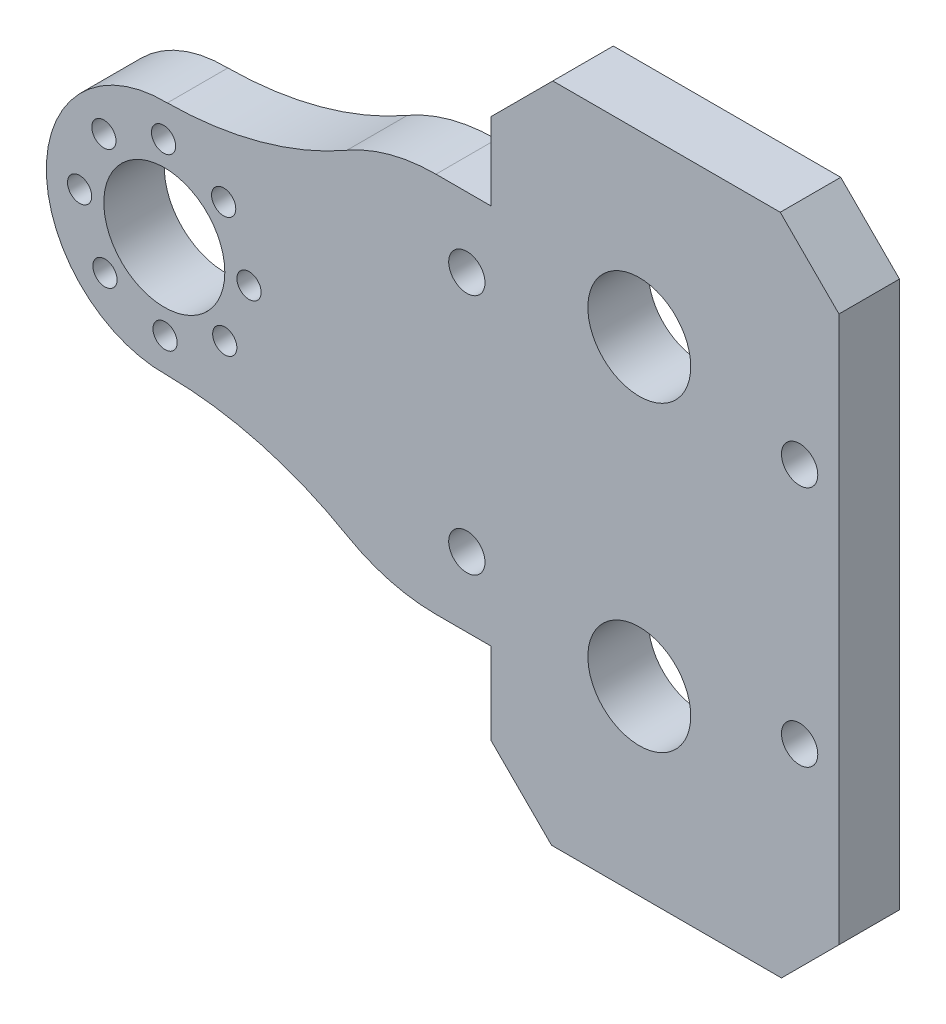
ISO-10303-21;
HEADER;
FILE_DESCRIPTION(('STEP AP214'),'2;1');
FILE_NAME('part.step','',(''),(''),'','','');
FILE_SCHEMA(('AUTOMOTIVE_DESIGN { 1 0 10303 214 1 1 1 1 }'));
ENDSEC;
DATA;
#1=APPLICATION_CONTEXT('core data for automotive mechanical design processes');
#2=APPLICATION_PROTOCOL_DEFINITION('international standard','automotive_design',2000,#1);
#3=PRODUCT_CONTEXT('',#1,'mechanical');
#4=PRODUCT('Part','Part','',(#3));
#5=PRODUCT_RELATED_PRODUCT_CATEGORY('part','',(#4));
#6=PRODUCT_DEFINITION_FORMATION('','',#4);
#7=PRODUCT_DEFINITION_CONTEXT('part definition',#1,'design');
#8=PRODUCT_DEFINITION('design','',#6,#7);
#9=PRODUCT_DEFINITION_SHAPE('','',#8);
#10=(LENGTH_UNIT() NAMED_UNIT(*) SI_UNIT(.MILLI.,.METRE.));
#11=(NAMED_UNIT(*) PLANE_ANGLE_UNIT() SI_UNIT($,.RADIAN.));
#12=(NAMED_UNIT(*) SI_UNIT($,.STERADIAN.) SOLID_ANGLE_UNIT());
#13=UNCERTAINTY_MEASURE_WITH_UNIT(LENGTH_MEASURE(1.E-05),#10,'distance_accuracy_value','');
#14=(GEOMETRIC_REPRESENTATION_CONTEXT(3) GLOBAL_UNCERTAINTY_ASSIGNED_CONTEXT((#13)) GLOBAL_UNIT_ASSIGNED_CONTEXT((#10,
#11,#12)) REPRESENTATION_CONTEXT('',''));
#15=CARTESIAN_POINT('',(0.,0.,0.));
#16=DIRECTION('',(0.,0.,1.));
#17=DIRECTION('',(1.,0.,0.));
#18=AXIS2_PLACEMENT_3D('',#15,#16,#17);
#19=CARTESIAN_POINT('',(16.700860260171,3.2922916539892,5.));
#20=DIRECTION('',(0.,0.,1.));
#21=DIRECTION('',(1.,0.,0.));
#22=AXIS2_PLACEMENT_3D('',#19,#20,#21);
#23=PLANE('',#22);
#24=CARTESIAN_POINT('',(-5.74908406047262,2.29229165398919,5.));
#25=DIRECTION('',(0.,0.,1.));
#26=DIRECTION('',(1.,0.,0.));
#27=AXIS2_PLACEMENT_3D('',#24,#25,#26);
#28=CIRCLE('',#27,5.);
#29=CARTESIAN_POINT('',(-0.749084060472621,2.29229165398919,5.));
#30=VERTEX_POINT('',#29);
#31=EDGE_CURVE('E407',#30,#30,#28,.T.);
#32=ORIENTED_EDGE('',*,*,#31,.F.);
#33=EDGE_LOOP('',(#32));
#34=FACE_BOUND('',#33,.T.);
#35=CARTESIAN_POINT('',(-5.8115386358992,9.29229165398919,5.));
#36=DIRECTION('',(0.,0.,1.));
#37=DIRECTION('',(1.,0.,0.));
#38=AXIS2_PLACEMENT_3D('',#35,#36,#37);
#39=CIRCLE('',#38,1.);
#40=CARTESIAN_POINT('',(-4.8115386358992,9.29229165398919,5.));
#41=VERTEX_POINT('',#40);
#42=EDGE_CURVE('E419',#41,#41,#39,.T.);
#43=ORIENTED_EDGE('',*,*,#42,.F.);
#44=EDGE_LOOP('',(#43));
#45=FACE_BOUND('',#44,.T.);
#46=CARTESIAN_POINT('',(-12.7490840604726,2.22983707856261,5.));
#47=DIRECTION('',(0.,0.,1.));
#48=DIRECTION('',(1.,0.,0.));
#49=AXIS2_PLACEMENT_3D('',#46,#47,#48);
#50=CIRCLE('',#49,0.999999999999998);
#51=CARTESIAN_POINT('',(-11.7490840604726,2.22983707856261,5.));
#52=VERTEX_POINT('',#51);
#53=EDGE_CURVE('E431',#52,#52,#50,.T.);
#54=ORIENTED_EDGE('',*,*,#53,.F.);
#55=EDGE_LOOP('',(#54));
#56=FACE_BOUND('',#55,.T.);
#57=CARTESIAN_POINT('',(-5.68662948504604,-4.70770834601081,5.));
#58=DIRECTION('',(0.,0.,1.));
#59=DIRECTION('',(1.,0.,0.));
#60=AXIS2_PLACEMENT_3D('',#57,#58,#59);
#61=CIRCLE('',#60,1.);
#62=CARTESIAN_POINT('',(-4.68662948504604,-4.70770834601081,5.));
#63=VERTEX_POINT('',#62);
#64=EDGE_CURVE('E443',#63,#63,#61,.T.);
#65=ORIENTED_EDGE('',*,*,#64,.F.);
#66=EDGE_LOOP('',(#65));
#67=FACE_BOUND('',#66,.T.);
#68=CARTESIAN_POINT('',(1.25091593952738,2.35474622941577,5.));
#69=DIRECTION('',(0.,0.,1.));
#70=DIRECTION('',(1.,0.,0.));
#71=AXIS2_PLACEMENT_3D('',#68,#69,#70);
#72=CIRCLE('',#71,1.);
#73=CARTESIAN_POINT('',(2.25091593952738,2.35474622941577,5.));
#74=VERTEX_POINT('',#73);
#75=EDGE_CURVE('E455',#74,#74,#72,.T.);
#76=ORIENTED_EDGE('',*,*,#75,.F.);
#77=EDGE_LOOP('',(#76));
#78=FACE_BOUND('',#77,.T.);
#79=CARTESIAN_POINT('',(19.2509159395274,-7.70770834601081,5.));
#80=DIRECTION('',(0.,0.,1.));
#81=DIRECTION('',(1.,0.,0.));
#82=AXIS2_PLACEMENT_3D('',#79,#80,#81);
#83=CIRCLE('',#82,1.5);
#84=CARTESIAN_POINT('',(20.7509159395274,-7.70770834601081,5.));
#85=VERTEX_POINT('',#84);
#86=EDGE_CURVE('E461',#85,#85,#83,.T.);
#87=ORIENTED_EDGE('',*,*,#86,.F.);
#88=EDGE_LOOP('',(#87));
#89=FACE_BOUND('',#88,.T.);
#90=CARTESIAN_POINT('',(33.5009159395274,-10.2077083460108,5.));
#91=DIRECTION('',(0.,0.,1.));
#92=DIRECTION('',(1.,0.,0.));
#93=AXIS2_PLACEMENT_3D('',#90,#91,#92);
#94=CIRCLE('',#93,4.25000000000001);
#95=CARTESIAN_POINT('',(37.7509159395274,-10.2077083460108,5.));
#96=VERTEX_POINT('',#95);
#97=EDGE_CURVE('E473',#96,#96,#94,.T.);
#98=ORIENTED_EDGE('',*,*,#97,.F.);
#99=EDGE_LOOP('',(#98));
#100=FACE_BOUND('',#99,.T.);
#101=CARTESIAN_POINT('',(46.7509159395274,12.2922916539892,5.));
#102=DIRECTION('',(0.,0.,1.));
#103=DIRECTION('',(1.,0.,0.));
#104=AXIS2_PLACEMENT_3D('',#101,#102,#103);
#105=CIRCLE('',#104,1.5);
#106=CARTESIAN_POINT('',(48.2509159395274,12.2922916539892,5.));
#107=VERTEX_POINT('',#106);
#108=EDGE_CURVE('E485',#107,#107,#105,.T.);
#109=ORIENTED_EDGE('',*,*,#108,.F.);
#110=EDGE_LOOP('',(#109));
#111=FACE_BOUND('',#110,.T.);
#112=DIRECTION('',(1.,0.,0.));
#113=VECTOR('',#112,1.);
#114=CARTESIAN_POINT('',(26.2509159395273,-25.2077083460108,5.));
#115=LINE('',#114,#113);
#116=CARTESIAN_POINT('',(26.2509159395273,-25.2077083460108,5.));
#117=VERTEX_POINT('',#116);
#118=CARTESIAN_POINT('',(45.2509159395274,-25.2077083460108,5.));
#119=VERTEX_POINT('',#118);
#120=EDGE_CURVE('E226',#117,#119,#115,.T.);
#121=ORIENTED_EDGE('',*,*,#120,.T.);
#122=DIRECTION('',(0.707106781186549,0.707106781186546,0.));
#123=VECTOR('',#122,1.);
#124=CARTESIAN_POINT('',(45.2509159395274,-25.2077083460108,5.));
#125=LINE('',#124,#123);
#126=CARTESIAN_POINT('',(50.0009159395274,-20.4577083460108,5.));
#127=VERTEX_POINT('',#126);
#128=EDGE_CURVE('E123',#119,#127,#125,.T.);
#129=ORIENTED_EDGE('',*,*,#128,.T.);
#130=DIRECTION('',(0.,1.,0.));
#131=VECTOR('',#130,1.);
#132=CARTESIAN_POINT('',(50.0009159395274,-20.4577083460108,5.));
#133=LINE('',#132,#131);
#134=CARTESIAN_POINT('',(50.0009159395274,24.6887382633959,5.));
#135=VERTEX_POINT('',#134);
#136=EDGE_CURVE('E272',#127,#135,#133,.T.);
#137=ORIENTED_EDGE('',*,*,#136,.T.);
#138=DIRECTION('',(-0.707106781186548,0.707106781186547,0.));
#139=VECTOR('',#138,1.);
#140=CARTESIAN_POINT('',(50.0009159395274,24.6887382633959,5.));
#141=LINE('',#140,#139);
#142=CARTESIAN_POINT('',(45.1473625489341,29.5422916539892,5.));
#143=VERTEX_POINT('',#142);
#144=EDGE_CURVE('E291',#135,#143,#141,.T.);
#145=ORIENTED_EDGE('',*,*,#144,.T.);
#146=DIRECTION('',(-1.,0.,0.));
#147=VECTOR('',#146,1.);
#148=CARTESIAN_POINT('',(45.1473625489341,29.5422916539892,5.));
#149=LINE('',#148,#147);
#150=CARTESIAN_POINT('',(26.3544693301207,29.5422916539892,5.));
#151=VERTEX_POINT('',#150);
#152=EDGE_CURVE('E288',#143,#151,#149,.T.);
#153=ORIENTED_EDGE('',*,*,#152,.T.);
#154=DIRECTION('',(-0.707106781186548,-0.707106781186547,0.));
#155=VECTOR('',#154,1.);
#156=CARTESIAN_POINT('',(26.3544693301207,29.5422916539892,5.));
#157=LINE('',#156,#155);
#158=CARTESIAN_POINT('',(21.2509159395274,24.4387382633959,5.));
#159=VERTEX_POINT('',#158);
#160=EDGE_CURVE('E290',#151,#159,#157,.T.);
#161=ORIENTED_EDGE('',*,*,#160,.T.);
#162=DIRECTION('',(0.,-1.,0.));
#163=VECTOR('',#162,1.);
#164=CARTESIAN_POINT('',(21.2509159395274,24.4387382633959,5.));
#165=LINE('',#164,#163);
#166=CARTESIAN_POINT('',(21.2509159395274,18.0422916539892,5.));
#167=VERTEX_POINT('',#166);
#168=EDGE_CURVE('E293',#159,#167,#165,.T.);
#169=ORIENTED_EDGE('',*,*,#168,.T.);
#170=DIRECTION('',(-1.,0.,0.));
#171=VECTOR('',#170,1.);
#172=CARTESIAN_POINT('',(21.2509159395274,18.0422916539892,5.));
#173=LINE('',#172,#171);
#174=CARTESIAN_POINT('',(16.700860260171,18.0422916539892,5.));
#175=VERTEX_POINT('',#174);
#176=EDGE_CURVE('E299',#167,#175,#173,.T.);
#177=ORIENTED_EDGE('',*,*,#176,.T.);
#178=CARTESIAN_POINT('',(16.700860260171,3.2922916539892,5.));
#179=DIRECTION('',(0.,0.,1.));
#180=DIRECTION('',(1.,0.,0.));
#181=AXIS2_PLACEMENT_3D('',#178,#179,#180);
#182=CIRCLE('',#181,14.75);
#183=CARTESIAN_POINT('',(9.34226739951562,16.0756249873225,5.));
#184=VERTEX_POINT('',#183);
#185=EDGE_CURVE('E301',#175,#184,#182,.T.);
#186=ORIENTED_EDGE('',*,*,#185,.T.);
#187=CARTESIAN_POINT('',(-5.74908406047262,42.2922916539892,5.));
#188=DIRECTION('',(0.,0.,-1.));
#189=DIRECTION('',(1.,0.,0.));
#190=AXIS2_PLACEMENT_3D('',#187,#188,#189);
#191=CIRCLE('',#190,30.25);
#192=CARTESIAN_POINT('',(-5.49908406047263,12.0433247294808,5.));
#193=VERTEX_POINT('',#192);
#194=EDGE_CURVE('E303',#184,#193,#191,.T.);
#195=ORIENTED_EDGE('',*,*,#194,.T.);
#196=DIRECTION('',(3.06941559721248E-12,-1.,0.));
#197=VECTOR('',#196,1.);
#198=CARTESIAN_POINT('',(-5.49908406047263,12.0433247294808,5.));
#199=LINE('',#198,#197);
#200=CARTESIAN_POINT('',(-5.49908406047262,12.0390859987982,5.));
#201=VERTEX_POINT('',#200);
#202=EDGE_CURVE('E305',#193,#201,#199,.T.);
#203=ORIENTED_EDGE('',*,*,#202,.T.);
#204=CARTESIAN_POINT('',(-5.74908406047262,2.29229165398919,5.));
#205=DIRECTION('',(0.,0.,1.));
#206=DIRECTION('',(1.,0.,0.));
#207=AXIS2_PLACEMENT_3D('',#204,#205,#206);
#208=CIRCLE('',#207,9.75);
#209=CARTESIAN_POINT('',(-5.49908406047262,-7.45450269081977,5.));
#210=VERTEX_POINT('',#209);
#211=EDGE_CURVE('E307',#201,#210,#208,.T.);
#212=ORIENTED_EDGE('',*,*,#211,.T.);
#213=DIRECTION('',(4.09255412961497E-13,-1.,0.));
#214=VECTOR('',#213,1.);
#215=CARTESIAN_POINT('',(-5.49908406047262,-7.45450269081977,5.));
#216=LINE('',#215,#214);
#217=CARTESIAN_POINT('',(-5.49908406047262,-7.45874142150246,5.));
#218=VERTEX_POINT('',#217);
#219=EDGE_CURVE('E309',#210,#218,#216,.T.);
#220=ORIENTED_EDGE('',*,*,#219,.T.);
#221=CARTESIAN_POINT('',(-5.74908406047262,-37.7077083460108,5.));
#222=DIRECTION('',(0.,0.,-1.));
#223=DIRECTION('',(1.,0.,0.));
#224=AXIS2_PLACEMENT_3D('',#221,#222,#223);
#225=CIRCLE('',#224,30.25);
#226=CARTESIAN_POINT('',(9.3422673995156,-11.4910416793441,5.));
#227=VERTEX_POINT('',#226);
#228=EDGE_CURVE('E311',#218,#227,#225,.T.);
#229=ORIENTED_EDGE('',*,*,#228,.T.);
#230=CARTESIAN_POINT('',(16.700860260171,1.2922916539892,5.));
#231=DIRECTION('',(0.,0.,1.));
#232=DIRECTION('',(1.,0.,0.));
#233=AXIS2_PLACEMENT_3D('',#230,#231,#232);
#234=CIRCLE('',#233,14.75);
#235=CARTESIAN_POINT('',(16.700860260171,-13.4577083460108,5.));
#236=VERTEX_POINT('',#235);
#237=EDGE_CURVE('E172',#227,#236,#234,.T.);
#238=ORIENTED_EDGE('',*,*,#237,.T.);
#239=DIRECTION('',(1.,0.,0.));
#240=VECTOR('',#239,1.);
#241=CARTESIAN_POINT('',(16.700860260171,-13.4577083460108,5.));
#242=LINE('',#241,#240);
#243=CARTESIAN_POINT('',(21.2509159395274,-13.4577083460108,5.));
#244=VERTEX_POINT('',#243);
#245=EDGE_CURVE('E166',#236,#244,#242,.T.);
#246=ORIENTED_EDGE('',*,*,#245,.T.);
#247=DIRECTION('',(0.,-1.,0.));
#248=VECTOR('',#247,1.);
#249=CARTESIAN_POINT('',(21.2509159395274,-13.4577083460108,5.));
#250=LINE('',#249,#248);
#251=CARTESIAN_POINT('',(21.2509159395274,-20.2077083460108,5.));
#252=VERTEX_POINT('',#251);
#253=EDGE_CURVE('E170',#244,#252,#250,.T.);
#254=ORIENTED_EDGE('',*,*,#253,.T.);
#255=DIRECTION('',(0.707106781186544,-0.707106781186551,0.));
#256=VECTOR('',#255,1.);
#257=CARTESIAN_POINT('',(21.2509159395274,-20.2077083460108,5.));
#258=LINE('',#257,#256);
#259=EDGE_CURVE('E50',#252,#117,#258,.T.);
#260=ORIENTED_EDGE('',*,*,#259,.T.);
#261=EDGE_LOOP('',(#121,#129,#137,#145,#153,#161,#169,#177,#186,#195,#203,#212,#220,#229,#238,
#246,#254,#260));
#262=FACE_BOUND('',#261,.T.);
#263=CARTESIAN_POINT('',(46.7509159395274,-7.70770834601081,5.));
#264=DIRECTION('',(0.,0.,1.));
#265=DIRECTION('',(1.,0.,0.));
#266=AXIS2_PLACEMENT_3D('',#263,#264,#265);
#267=CIRCLE('',#266,1.5);
#268=CARTESIAN_POINT('',(48.2509159395274,-7.70770834601081,5.));
#269=VERTEX_POINT('',#268);
#270=EDGE_CURVE('E193',#269,#269,#267,.T.);
#271=ORIENTED_EDGE('',*,*,#270,.F.);
#272=EDGE_LOOP('',(#271));
#273=FACE_BOUND('',#272,.T.);
#274=CARTESIAN_POINT('',(33.5009159395274,14.7922916539892,5.));
#275=DIRECTION('',(0.,0.,1.));
#276=DIRECTION('',(1.,0.,0.));
#277=AXIS2_PLACEMENT_3D('',#274,#275,#276);
#278=CIRCLE('',#277,4.25);
#279=CARTESIAN_POINT('',(37.7509159395274,14.7922916539892,5.));
#280=VERTEX_POINT('',#279);
#281=EDGE_CURVE('E479',#280,#280,#278,.T.);
#282=ORIENTED_EDGE('',*,*,#281,.F.);
#283=EDGE_LOOP('',(#282));
#284=FACE_BOUND('',#283,.T.);
#285=CARTESIAN_POINT('',(19.2509159395274,12.2922916539892,5.));
#286=DIRECTION('',(0.,0.,1.));
#287=DIRECTION('',(1.,0.,0.));
#288=AXIS2_PLACEMENT_3D('',#285,#286,#287);
#289=CIRCLE('',#288,1.5);
#290=CARTESIAN_POINT('',(20.7509159395274,12.2922916539892,5.));
#291=VERTEX_POINT('',#290);
#292=EDGE_CURVE('E467',#291,#291,#289,.T.);
#293=ORIENTED_EDGE('',*,*,#292,.F.);
#294=EDGE_LOOP('',(#293));
#295=FACE_BOUND('',#294,.T.);
#296=CARTESIAN_POINT('',(-0.755373292965727,-2.61309852116362,5.));
#297=DIRECTION('',(0.,0.,1.));
#298=DIRECTION('',(1.,0.,0.));
#299=AXIS2_PLACEMENT_3D('',#296,#297,#298);
#300=CIRCLE('',#299,1.);
#301=CARTESIAN_POINT('',(0.244626707034274,-2.61309852116362,5.));
#302=VERTEX_POINT('',#301);
#303=EDGE_CURVE('E449',#302,#302,#300,.T.);
#304=ORIENTED_EDGE('',*,*,#303,.F.);
#305=EDGE_LOOP('',(#304));
#306=FACE_BOUND('',#305,.T.);
#307=CARTESIAN_POINT('',(-10.6544742356254,-2.7014191135177,5.));
#308=DIRECTION('',(0.,0.,1.));
#309=DIRECTION('',(1.,0.,0.));
#310=AXIS2_PLACEMENT_3D('',#307,#308,#309);
#311=CIRCLE('',#310,0.999999999999998);
#312=CARTESIAN_POINT('',(-9.65447423562543,-2.7014191135177,5.));
#313=VERTEX_POINT('',#312);
#314=EDGE_CURVE('E437',#313,#313,#311,.T.);
#315=ORIENTED_EDGE('',*,*,#314,.F.);
#316=EDGE_LOOP('',(#315));
#317=FACE_BOUND('',#316,.T.);
#318=CARTESIAN_POINT('',(-10.7427948279795,7.197681829142,5.));
#319=DIRECTION('',(0.,0.,1.));
#320=DIRECTION('',(1.,0.,0.));
#321=AXIS2_PLACEMENT_3D('',#318,#319,#320);
#322=CIRCLE('',#321,1.);
#323=CARTESIAN_POINT('',(-9.74279482797952,7.197681829142,5.));
#324=VERTEX_POINT('',#323);
#325=EDGE_CURVE('E425',#324,#324,#322,.T.);
#326=ORIENTED_EDGE('',*,*,#325,.F.);
#327=EDGE_LOOP('',(#326));
#328=FACE_BOUND('',#327,.T.);
#329=CARTESIAN_POINT('',(-0.843693885319811,7.28600242149609,5.));
#330=DIRECTION('',(0.,0.,1.));
#331=DIRECTION('',(1.,0.,0.));
#332=AXIS2_PLACEMENT_3D('',#329,#330,#331);
#333=CIRCLE('',#332,1.);
#334=CARTESIAN_POINT('',(0.156306114680189,7.28600242149609,5.));
#335=VERTEX_POINT('',#334);
#336=EDGE_CURVE('E412',#335,#335,#333,.T.);
#337=ORIENTED_EDGE('',*,*,#336,.F.);
#338=EDGE_LOOP('',(#337));
#339=FACE_BOUND('',#338,.T.);
#340=ADVANCED_FACE('F32',(#34,#45,#56,#67,#78,#89,#100,#111,#262,#273,#284,#295,#306,#317,#328,
#339),#23,.T.);
#341=CARTESIAN_POINT('',(16.700860260171,3.2922916539892,0.));
#342=DIRECTION('',(0.,0.,1.));
#343=DIRECTION('',(1.,0.,0.));
#344=AXIS2_PLACEMENT_3D('',#341,#342,#343);
#345=PLANE('',#344);
#346=CARTESIAN_POINT('',(-5.74908406047262,2.29229165398919,0.));
#347=DIRECTION('',(0.,0.,1.));
#348=DIRECTION('',(1.,0.,0.));
#349=AXIS2_PLACEMENT_3D('',#346,#347,#348);
#350=CIRCLE('',#349,5.);
#351=CARTESIAN_POINT('',(-0.749084060472621,2.29229165398919,0.));
#352=VERTEX_POINT('',#351);
#353=EDGE_CURVE('E36',#352,#352,#350,.T.);
#354=ORIENTED_EDGE('',*,*,#353,.T.);
#355=EDGE_LOOP('',(#354));
#356=FACE_BOUND('',#355,.T.);
#357=DIRECTION('',(1.,0.,0.));
#358=VECTOR('',#357,1.);
#359=CARTESIAN_POINT('',(26.2509159395273,-25.2077083460108,0.));
#360=LINE('',#359,#358);
#361=CARTESIAN_POINT('',(26.2509159395273,-25.2077083460108,0.));
#362=VERTEX_POINT('',#361);
#363=CARTESIAN_POINT('',(45.2509159395274,-25.2077083460108,0.));
#364=VERTEX_POINT('',#363);
#365=EDGE_CURVE('E189',#362,#364,#360,.T.);
#366=ORIENTED_EDGE('',*,*,#365,.F.);
#367=DIRECTION('',(0.707106781186544,-0.707106781186551,0.));
#368=VECTOR('',#367,1.);
#369=CARTESIAN_POINT('',(21.2509159395274,-20.2077083460108,0.));
#370=LINE('',#369,#368);
#371=CARTESIAN_POINT('',(21.2509159395274,-20.2077083460108,0.));
#372=VERTEX_POINT('',#371);
#373=EDGE_CURVE('E115',#372,#362,#370,.T.);
#374=ORIENTED_EDGE('',*,*,#373,.F.);
#375=DIRECTION('',(0.,-1.,0.));
#376=VECTOR('',#375,1.);
#377=CARTESIAN_POINT('',(21.2509159395274,-13.4577083460108,0.));
#378=LINE('',#377,#376);
#379=CARTESIAN_POINT('',(21.2509159395274,-13.4577083460108,0.));
#380=VERTEX_POINT('',#379);
#381=EDGE_CURVE('E109',#380,#372,#378,.T.);
#382=ORIENTED_EDGE('',*,*,#381,.F.);
#383=DIRECTION('',(1.,0.,0.));
#384=VECTOR('',#383,1.);
#385=CARTESIAN_POINT('',(20.4080953628798,-13.4577083460108,0.));
#386=LINE('',#385,#384);
#387=CARTESIAN_POINT('',(16.700860260171,-13.4577083460108,0.));
#388=VERTEX_POINT('',#387);
#389=EDGE_CURVE('E179',#388,#380,#386,.T.);
#390=ORIENTED_EDGE('',*,*,#389,.F.);
#391=CARTESIAN_POINT('',(16.700860260171,1.2922916539892,0.));
#392=DIRECTION('',(0.,0.,1.));
#393=DIRECTION('',(1.,0.,0.));
#394=AXIS2_PLACEMENT_3D('',#391,#392,#393);
#395=CIRCLE('',#394,14.75);
#396=CARTESIAN_POINT('',(9.3422673995156,-11.4910416793441,0.));
#397=VERTEX_POINT('',#396);
#398=EDGE_CURVE('E220',#397,#388,#395,.T.);
#399=ORIENTED_EDGE('',*,*,#398,.F.);
#400=CARTESIAN_POINT('',(-5.74908406047262,-37.7077083460108,0.));
#401=DIRECTION('',(0.,0.,-1.));
#402=DIRECTION('',(1.,0.,0.));
#403=AXIS2_PLACEMENT_3D('',#400,#401,#402);
#404=CIRCLE('',#403,30.25);
#405=CARTESIAN_POINT('',(-5.49908406047262,-7.45874142150246,0.));
#406=VERTEX_POINT('',#405);
#407=EDGE_CURVE('E218',#406,#397,#404,.T.);
#408=ORIENTED_EDGE('',*,*,#407,.F.);
#409=DIRECTION('',(4.09255412961497E-13,-1.,0.));
#410=VECTOR('',#409,1.);
#411=CARTESIAN_POINT('',(-5.49908406047262,-7.45450269081977,0.));
#412=LINE('',#411,#410);
#413=CARTESIAN_POINT('',(-5.49908406047262,-7.45450269081977,0.));
#414=VERTEX_POINT('',#413);
#415=EDGE_CURVE('E216',#414,#406,#412,.T.);
#416=ORIENTED_EDGE('',*,*,#415,.F.);
#417=CARTESIAN_POINT('',(-5.74908406047262,2.29229165398919,0.));
#418=DIRECTION('',(0.,0.,1.));
#419=DIRECTION('',(1.,0.,0.));
#420=AXIS2_PLACEMENT_3D('',#417,#418,#419);
#421=CIRCLE('',#420,9.75);
#422=CARTESIAN_POINT('',(-5.49908406047262,12.0390859987982,0.));
#423=VERTEX_POINT('',#422);
#424=EDGE_CURVE('E214',#423,#414,#421,.T.);
#425=ORIENTED_EDGE('',*,*,#424,.F.);
#426=DIRECTION('',(3.06941559721248E-12,-1.,0.));
#427=VECTOR('',#426,1.);
#428=CARTESIAN_POINT('',(-5.49908406047263,12.0433247294808,0.));
#429=LINE('',#428,#427);
#430=CARTESIAN_POINT('',(-5.49908406047263,12.0433247294808,0.));
#431=VERTEX_POINT('',#430);
#432=EDGE_CURVE('E212',#431,#423,#429,.T.);
#433=ORIENTED_EDGE('',*,*,#432,.F.);
#434=CARTESIAN_POINT('',(-5.74908406047262,42.2922916539892,0.));
#435=DIRECTION('',(0.,0.,-1.));
#436=DIRECTION('',(1.,0.,0.));
#437=AXIS2_PLACEMENT_3D('',#434,#435,#436);
#438=CIRCLE('',#437,30.25);
#439=CARTESIAN_POINT('',(9.34226739951562,16.0756249873225,0.));
#440=VERTEX_POINT('',#439);
#441=EDGE_CURVE('E210',#440,#431,#438,.T.);
#442=ORIENTED_EDGE('',*,*,#441,.F.);
#443=CARTESIAN_POINT('',(16.700860260171,3.2922916539892,0.));
#444=DIRECTION('',(0.,0.,1.));
#445=DIRECTION('',(1.,0.,0.));
#446=AXIS2_PLACEMENT_3D('',#443,#444,#445);
#447=CIRCLE('',#446,14.75);
#448=CARTESIAN_POINT('',(16.700860260171,18.0422916539892,0.));
#449=VERTEX_POINT('',#448);
#450=EDGE_CURVE('E208',#449,#440,#447,.T.);
#451=ORIENTED_EDGE('',*,*,#450,.F.);
#452=DIRECTION('',(-1.,0.,0.));
#453=VECTOR('',#452,1.);
#454=CARTESIAN_POINT('',(20.4080953628798,18.0422916539892,0.));
#455=LINE('',#454,#453);
#456=CARTESIAN_POINT('',(21.2509159395274,18.0422916539892,0.));
#457=VERTEX_POINT('',#456);
#458=EDGE_CURVE('E206',#457,#449,#455,.T.);
#459=ORIENTED_EDGE('',*,*,#458,.F.);
#460=DIRECTION('',(0.,-1.,0.));
#461=VECTOR('',#460,1.);
#462=CARTESIAN_POINT('',(21.2509159395274,24.4387382633959,0.));
#463=LINE('',#462,#461);
#464=CARTESIAN_POINT('',(21.2509159395274,24.4387382633959,0.));
#465=VERTEX_POINT('',#464);
#466=EDGE_CURVE('E203',#465,#457,#463,.T.);
#467=ORIENTED_EDGE('',*,*,#466,.F.);
#468=DIRECTION('',(-0.707106781186548,-0.707106781186547,0.));
#469=VECTOR('',#468,1.);
#470=CARTESIAN_POINT('',(26.3544693301207,29.5422916539892,0.));
#471=LINE('',#470,#469);
#472=CARTESIAN_POINT('',(26.3544693301207,29.5422916539892,0.));
#473=VERTEX_POINT('',#472);
#474=EDGE_CURVE('E201',#473,#465,#471,.T.);
#475=ORIENTED_EDGE('',*,*,#474,.F.);
#476=DIRECTION('',(-1.,0.,0.));
#477=VECTOR('',#476,1.);
#478=CARTESIAN_POINT('',(45.1473625489341,29.5422916539892,0.));
#479=LINE('',#478,#477);
#480=CARTESIAN_POINT('',(45.1473625489341,29.5422916539892,0.));
#481=VERTEX_POINT('',#480);
#482=EDGE_CURVE('E199',#481,#473,#479,.T.);
#483=ORIENTED_EDGE('',*,*,#482,.F.);
#484=DIRECTION('',(-0.707106781186548,0.707106781186547,0.));
#485=VECTOR('',#484,1.);
#486=CARTESIAN_POINT('',(50.0009159395274,24.6887382633959,0.));
#487=LINE('',#486,#485);
#488=CARTESIAN_POINT('',(50.0009159395274,24.6887382633959,0.));
#489=VERTEX_POINT('',#488);
#490=EDGE_CURVE('E197',#489,#481,#487,.T.);
#491=ORIENTED_EDGE('',*,*,#490,.F.);
#492=DIRECTION('',(0.,1.,0.));
#493=VECTOR('',#492,1.);
#494=CARTESIAN_POINT('',(50.0009159395274,-20.4577083460108,0.));
#495=LINE('',#494,#493);
#496=CARTESIAN_POINT('',(50.0009159395274,-20.4577083460108,0.));
#497=VERTEX_POINT('',#496);
#498=EDGE_CURVE('E195',#497,#489,#495,.T.);
#499=ORIENTED_EDGE('',*,*,#498,.F.);
#500=DIRECTION('',(0.707106781186549,0.707106781186546,0.));
#501=VECTOR('',#500,1.);
#502=CARTESIAN_POINT('',(45.2509159395274,-25.2077083460108,0.));
#503=LINE('',#502,#501);
#504=EDGE_CURVE('E192',#364,#497,#503,.T.);
#505=ORIENTED_EDGE('',*,*,#504,.F.);
#506=EDGE_LOOP('',(#366,#374,#382,#390,#399,#408,#416,#425,#433,#442,#451,#459,#467,#475,#483,
#491,#499,#505));
#507=FACE_BOUND('',#506,.T.);
#508=CARTESIAN_POINT('',(46.7509159395274,-7.70770834601081,0.));
#509=DIRECTION('',(0.,0.,1.));
#510=DIRECTION('',(1.,0.,0.));
#511=AXIS2_PLACEMENT_3D('',#508,#509,#510);
#512=CIRCLE('',#511,1.5);
#513=CARTESIAN_POINT('',(48.2509159395274,-7.70770834601081,0.));
#514=VERTEX_POINT('',#513);
#515=EDGE_CURVE('E488',#514,#514,#512,.T.);
#516=ORIENTED_EDGE('',*,*,#515,.T.);
#517=EDGE_LOOP('',(#516));
#518=FACE_BOUND('',#517,.T.);
#519=CARTESIAN_POINT('',(46.7509159395274,12.2922916539892,0.));
#520=DIRECTION('',(0.,0.,1.));
#521=DIRECTION('',(1.,0.,0.));
#522=AXIS2_PLACEMENT_3D('',#519,#520,#521);
#523=CIRCLE('',#522,1.5);
#524=CARTESIAN_POINT('',(48.2509159395274,12.2922916539892,0.));
#525=VERTEX_POINT('',#524);
#526=EDGE_CURVE('E482',#525,#525,#523,.T.);
#527=ORIENTED_EDGE('',*,*,#526,.T.);
#528=EDGE_LOOP('',(#527));
#529=FACE_BOUND('',#528,.T.);
#530=CARTESIAN_POINT('',(33.5009159395274,14.7922916539892,0.));
#531=DIRECTION('',(0.,0.,1.));
#532=DIRECTION('',(1.,0.,0.));
#533=AXIS2_PLACEMENT_3D('',#530,#531,#532);
#534=CIRCLE('',#533,4.25);
#535=CARTESIAN_POINT('',(37.7509159395274,14.7922916539892,0.));
#536=VERTEX_POINT('',#535);
#537=EDGE_CURVE('E476',#536,#536,#534,.T.);
#538=ORIENTED_EDGE('',*,*,#537,.T.);
#539=EDGE_LOOP('',(#538));
#540=FACE_BOUND('',#539,.T.);
#541=CARTESIAN_POINT('',(33.5009159395274,-10.2077083460108,0.));
#542=DIRECTION('',(0.,0.,1.));
#543=DIRECTION('',(1.,0.,0.));
#544=AXIS2_PLACEMENT_3D('',#541,#542,#543);
#545=CIRCLE('',#544,4.25000000000001);
#546=CARTESIAN_POINT('',(37.7509159395274,-10.2077083460108,0.));
#547=VERTEX_POINT('',#546);
#548=EDGE_CURVE('E470',#547,#547,#545,.T.);
#549=ORIENTED_EDGE('',*,*,#548,.T.);
#550=EDGE_LOOP('',(#549));
#551=FACE_BOUND('',#550,.T.);
#552=CARTESIAN_POINT('',(19.2509159395274,12.2922916539892,0.));
#553=DIRECTION('',(0.,0.,1.));
#554=DIRECTION('',(1.,0.,0.));
#555=AXIS2_PLACEMENT_3D('',#552,#553,#554);
#556=CIRCLE('',#555,1.5);
#557=CARTESIAN_POINT('',(20.7509159395274,12.2922916539892,0.));
#558=VERTEX_POINT('',#557);
#559=EDGE_CURVE('E464',#558,#558,#556,.T.);
#560=ORIENTED_EDGE('',*,*,#559,.T.);
#561=EDGE_LOOP('',(#560));
#562=FACE_BOUND('',#561,.T.);
#563=CARTESIAN_POINT('',(19.2509159395274,-7.70770834601081,0.));
#564=DIRECTION('',(0.,0.,1.));
#565=DIRECTION('',(1.,0.,0.));
#566=AXIS2_PLACEMENT_3D('',#563,#564,#565);
#567=CIRCLE('',#566,1.5);
#568=CARTESIAN_POINT('',(20.7509159395274,-7.70770834601081,0.));
#569=VERTEX_POINT('',#568);
#570=EDGE_CURVE('E458',#569,#569,#567,.T.);
#571=ORIENTED_EDGE('',*,*,#570,.T.);
#572=EDGE_LOOP('',(#571));
#573=FACE_BOUND('',#572,.T.);
#574=CARTESIAN_POINT('',(1.25091593952738,2.35474622941577,0.));
#575=DIRECTION('',(0.,0.,1.));
#576=DIRECTION('',(1.,0.,0.));
#577=AXIS2_PLACEMENT_3D('',#574,#575,#576);
#578=CIRCLE('',#577,1.);
#579=CARTESIAN_POINT('',(2.25091593952738,2.35474622941577,0.));
#580=VERTEX_POINT('',#579);
#581=EDGE_CURVE('E452',#580,#580,#578,.T.);
#582=ORIENTED_EDGE('',*,*,#581,.T.);
#583=EDGE_LOOP('',(#582));
#584=FACE_BOUND('',#583,.T.);
#585=CARTESIAN_POINT('',(-0.755373292965727,-2.61309852116362,0.));
#586=DIRECTION('',(0.,0.,1.));
#587=DIRECTION('',(1.,0.,0.));
#588=AXIS2_PLACEMENT_3D('',#585,#586,#587);
#589=CIRCLE('',#588,1.);
#590=CARTESIAN_POINT('',(0.244626707034274,-2.61309852116362,0.));
#591=VERTEX_POINT('',#590);
#592=EDGE_CURVE('E446',#591,#591,#589,.T.);
#593=ORIENTED_EDGE('',*,*,#592,.T.);
#594=EDGE_LOOP('',(#593));
#595=FACE_BOUND('',#594,.T.);
#596=CARTESIAN_POINT('',(-5.68662948504604,-4.70770834601081,0.));
#597=DIRECTION('',(0.,0.,1.));
#598=DIRECTION('',(1.,0.,0.));
#599=AXIS2_PLACEMENT_3D('',#596,#597,#598);
#600=CIRCLE('',#599,1.);
#601=CARTESIAN_POINT('',(-4.68662948504604,-4.70770834601081,0.));
#602=VERTEX_POINT('',#601);
#603=EDGE_CURVE('E440',#602,#602,#600,.T.);
#604=ORIENTED_EDGE('',*,*,#603,.T.);
#605=EDGE_LOOP('',(#604));
#606=FACE_BOUND('',#605,.T.);
#607=CARTESIAN_POINT('',(-10.6544742356254,-2.7014191135177,0.));
#608=DIRECTION('',(0.,0.,1.));
#609=DIRECTION('',(1.,0.,0.));
#610=AXIS2_PLACEMENT_3D('',#607,#608,#609);
#611=CIRCLE('',#610,0.999999999999998);
#612=CARTESIAN_POINT('',(-9.65447423562543,-2.7014191135177,0.));
#613=VERTEX_POINT('',#612);
#614=EDGE_CURVE('E434',#613,#613,#611,.T.);
#615=ORIENTED_EDGE('',*,*,#614,.T.);
#616=EDGE_LOOP('',(#615));
#617=FACE_BOUND('',#616,.T.);
#618=CARTESIAN_POINT('',(-12.7490840604726,2.22983707856261,0.));
#619=DIRECTION('',(0.,0.,1.));
#620=DIRECTION('',(1.,0.,0.));
#621=AXIS2_PLACEMENT_3D('',#618,#619,#620);
#622=CIRCLE('',#621,0.999999999999998);
#623=CARTESIAN_POINT('',(-11.7490840604726,2.22983707856261,0.));
#624=VERTEX_POINT('',#623);
#625=EDGE_CURVE('E428',#624,#624,#622,.T.);
#626=ORIENTED_EDGE('',*,*,#625,.T.);
#627=EDGE_LOOP('',(#626));
#628=FACE_BOUND('',#627,.T.);
#629=CARTESIAN_POINT('',(-10.7427948279795,7.197681829142,0.));
#630=DIRECTION('',(0.,0.,1.));
#631=DIRECTION('',(1.,0.,0.));
#632=AXIS2_PLACEMENT_3D('',#629,#630,#631);
#633=CIRCLE('',#632,1.);
#634=CARTESIAN_POINT('',(-9.74279482797952,7.197681829142,0.));
#635=VERTEX_POINT('',#634);
#636=EDGE_CURVE('E422',#635,#635,#633,.T.);
#637=ORIENTED_EDGE('',*,*,#636,.T.);
#638=EDGE_LOOP('',(#637));
#639=FACE_BOUND('',#638,.T.);
#640=CARTESIAN_POINT('',(-5.8115386358992,9.29229165398919,0.));
#641=DIRECTION('',(0.,0.,1.));
#642=DIRECTION('',(1.,0.,0.));
#643=AXIS2_PLACEMENT_3D('',#640,#641,#642);
#644=CIRCLE('',#643,1.);
#645=CARTESIAN_POINT('',(-4.8115386358992,9.29229165398919,0.));
#646=VERTEX_POINT('',#645);
#647=EDGE_CURVE('E417',#646,#646,#644,.T.);
#648=ORIENTED_EDGE('',*,*,#647,.T.);
#649=EDGE_LOOP('',(#648));
#650=FACE_BOUND('',#649,.T.);
#651=CARTESIAN_POINT('',(-0.843693885319811,7.28600242149609,0.));
#652=DIRECTION('',(0.,0.,1.));
#653=DIRECTION('',(1.,0.,0.));
#654=AXIS2_PLACEMENT_3D('',#651,#652,#653);
#655=CIRCLE('',#654,1.);
#656=CARTESIAN_POINT('',(0.156306114680189,7.28600242149609,0.));
#657=VERTEX_POINT('',#656);
#658=EDGE_CURVE('E410',#657,#657,#655,.T.);
#659=ORIENTED_EDGE('',*,*,#658,.T.);
#660=EDGE_LOOP('',(#659));
#661=FACE_BOUND('',#660,.T.);
#662=ADVANCED_FACE('F276',(#356,#507,#518,#529,#540,#551,#562,#573,#584,#595,#606,#617,#628,
#639,#650,#661),#345,.F.);
#663=CARTESIAN_POINT('',(26.2509159395273,-25.2077083460108,5.));
#664=DIRECTION('',(0.,1.,0.));
#665=DIRECTION('',(0.,0.,1.));
#666=AXIS2_PLACEMENT_3D('',#663,#664,#665);
#667=PLANE('',#666);
#668=ORIENTED_EDGE('',*,*,#365,.T.);
#669=DIRECTION('',(0.,0.,-1.));
#670=VECTOR('',#669,1.);
#671=CARTESIAN_POINT('',(45.2509159395274,-25.2077083460108,5.));
#672=LINE('',#671,#670);
#673=EDGE_CURVE('E11',#119,#364,#672,.T.);
#674=ORIENTED_EDGE('',*,*,#673,.F.);
#675=ORIENTED_EDGE('',*,*,#120,.F.);
#676=DIRECTION('',(0.,0.,-1.));
#677=VECTOR('',#676,1.);
#678=CARTESIAN_POINT('',(26.2509159395273,-25.2077083460108,5.));
#679=LINE('',#678,#677);
#680=EDGE_CURVE('E185',#117,#362,#679,.T.);
#681=ORIENTED_EDGE('',*,*,#680,.T.);
#682=EDGE_LOOP('',(#668,#674,#675,#681));
#683=FACE_BOUND('',#682,.T.);
#684=ADVANCED_FACE('F34',(#683),#667,.F.);
#685=CARTESIAN_POINT('',(45.2509159395274,-25.2077083460108,5.));
#686=DIRECTION('',(-0.707106781186546,0.707106781186549,0.));
#687=DIRECTION('',(-0.707106781186549,-0.707106781186546,0.));
#688=AXIS2_PLACEMENT_3D('',#685,#686,#687);
#689=PLANE('',#688);
#690=ORIENTED_EDGE('',*,*,#504,.T.);
#691=DIRECTION('',(0.,0.,-1.));
#692=VECTOR('',#691,1.);
#693=CARTESIAN_POINT('',(50.0009159395274,-20.4577083460108,5.));
#694=LINE('',#693,#692);
#695=EDGE_CURVE('E42',#127,#497,#694,.T.);
#696=ORIENTED_EDGE('',*,*,#695,.F.);
#697=ORIENTED_EDGE('',*,*,#128,.F.);
#698=ORIENTED_EDGE('',*,*,#673,.T.);
#699=EDGE_LOOP('',(#690,#696,#697,#698));
#700=FACE_BOUND('',#699,.T.);
#701=ADVANCED_FACE('F761',(#700),#689,.F.);
#702=CARTESIAN_POINT('',(50.0009159395274,-20.4577083460108,5.));
#703=DIRECTION('',(-1.,0.,0.));
#704=DIRECTION('',(0.,-1.,0.));
#705=AXIS2_PLACEMENT_3D('',#702,#703,#704);
#706=PLANE('',#705);
#707=ORIENTED_EDGE('',*,*,#498,.T.);
#708=DIRECTION('',(0.,0.,-1.));
#709=VECTOR('',#708,1.);
#710=CARTESIAN_POINT('',(50.0009159395274,24.6887382633959,5.));
#711=LINE('',#710,#709);
#712=EDGE_CURVE('E263',#135,#489,#711,.T.);
#713=ORIENTED_EDGE('',*,*,#712,.F.);
#714=ORIENTED_EDGE('',*,*,#136,.F.);
#715=ORIENTED_EDGE('',*,*,#695,.T.);
#716=EDGE_LOOP('',(#707,#713,#714,#715));
#717=FACE_BOUND('',#716,.T.);
#718=ADVANCED_FACE('F270',(#717),#706,.F.);
#719=CARTESIAN_POINT('',(50.0009159395274,24.6887382633959,5.));
#720=DIRECTION('',(-0.707106781186547,-0.707106781186548,0.));
#721=DIRECTION('',(0.707106781186548,-0.707106781186547,0.));
#722=AXIS2_PLACEMENT_3D('',#719,#720,#721);
#723=PLANE('',#722);
#724=ORIENTED_EDGE('',*,*,#490,.T.);
#725=DIRECTION('',(0.,0.,-1.));
#726=VECTOR('',#725,1.);
#727=CARTESIAN_POINT('',(45.1473625489341,29.5422916539892,5.));
#728=LINE('',#727,#726);
#729=EDGE_CURVE('E260',#143,#481,#728,.T.);
#730=ORIENTED_EDGE('',*,*,#729,.F.);
#731=ORIENTED_EDGE('',*,*,#144,.F.);
#732=ORIENTED_EDGE('',*,*,#712,.T.);
#733=EDGE_LOOP('',(#724,#730,#731,#732));
#734=FACE_BOUND('',#733,.T.);
#735=ADVANCED_FACE('F282',(#734),#723,.F.);
#736=CARTESIAN_POINT('',(45.1473625489341,29.5422916539892,5.));
#737=DIRECTION('',(0.,-1.,0.));
#738=DIRECTION('',(1.,0.,0.));
#739=AXIS2_PLACEMENT_3D('',#736,#737,#738);
#740=PLANE('',#739);
#741=ORIENTED_EDGE('',*,*,#482,.T.);
#742=DIRECTION('',(0.,0.,-1.));
#743=VECTOR('',#742,1.);
#744=CARTESIAN_POINT('',(26.3544693301207,29.5422916539892,5.));
#745=LINE('',#744,#743);
#746=EDGE_CURVE('E257',#151,#473,#745,.T.);
#747=ORIENTED_EDGE('',*,*,#746,.F.);
#748=ORIENTED_EDGE('',*,*,#152,.F.);
#749=ORIENTED_EDGE('',*,*,#729,.T.);
#750=EDGE_LOOP('',(#741,#747,#748,#749));
#751=FACE_BOUND('',#750,.T.);
#752=ADVANCED_FACE('F286',(#751),#740,.F.);
#753=CARTESIAN_POINT('',(26.3544693301207,29.5422916539892,5.));
#754=DIRECTION('',(0.707106781186547,-0.707106781186548,0.));
#755=DIRECTION('',(0.707106781186548,0.707106781186547,0.));
#756=AXIS2_PLACEMENT_3D('',#753,#754,#755);
#757=PLANE('',#756);
#758=ORIENTED_EDGE('',*,*,#474,.T.);
#759=DIRECTION('',(0.,0.,-1.));
#760=VECTOR('',#759,1.);
#761=CARTESIAN_POINT('',(21.2509159395274,24.4387382633959,5.));
#762=LINE('',#761,#760);
#763=EDGE_CURVE('E254',#159,#465,#762,.T.);
#764=ORIENTED_EDGE('',*,*,#763,.F.);
#765=ORIENTED_EDGE('',*,*,#160,.F.);
#766=ORIENTED_EDGE('',*,*,#746,.T.);
#767=EDGE_LOOP('',(#758,#764,#765,#766));
#768=FACE_BOUND('',#767,.T.);
#769=ADVANCED_FACE('F726',(#768),#757,.F.);
#770=CARTESIAN_POINT('',(21.2509159395274,24.4387382633959,5.));
#771=DIRECTION('',(1.,0.,0.));
#772=DIRECTION('',(0.,0.,-1.));
#773=AXIS2_PLACEMENT_3D('',#770,#771,#772);
#774=PLANE('',#773);
#775=ORIENTED_EDGE('',*,*,#466,.T.);
#776=DIRECTION('',(0.,0.,-1.));
#777=VECTOR('',#776,1.);
#778=CARTESIAN_POINT('',(21.2509159395274,18.0422916539892,5.));
#779=LINE('',#778,#777);
#780=EDGE_CURVE('E251',#167,#457,#779,.T.);
#781=ORIENTED_EDGE('',*,*,#780,.F.);
#782=ORIENTED_EDGE('',*,*,#168,.F.);
#783=ORIENTED_EDGE('',*,*,#763,.T.);
#784=EDGE_LOOP('',(#775,#781,#782,#783));
#785=FACE_BOUND('',#784,.T.);
#786=ADVANCED_FACE('F715',(#785),#774,.F.);
#787=CARTESIAN_POINT('',(20.4080953628798,18.0422916539892,5.));
#788=DIRECTION('',(0.,-1.,0.));
#789=DIRECTION('',(0.,0.,-1.));
#790=AXIS2_PLACEMENT_3D('',#787,#788,#789);
#791=PLANE('',#790);
#792=ORIENTED_EDGE('',*,*,#458,.T.);
#793=DIRECTION('',(0.,0.,-1.));
#794=VECTOR('',#793,1.);
#795=CARTESIAN_POINT('',(16.700860260171,18.0422916539892,5.));
#796=LINE('',#795,#794);
#797=EDGE_CURVE('E248',#175,#449,#796,.T.);
#798=ORIENTED_EDGE('',*,*,#797,.F.);
#799=ORIENTED_EDGE('',*,*,#176,.F.);
#800=ORIENTED_EDGE('',*,*,#780,.T.);
#801=EDGE_LOOP('',(#792,#798,#799,#800));
#802=FACE_BOUND('',#801,.T.);
#803=ADVANCED_FACE('F705',(#802),#791,.F.);
#804=CARTESIAN_POINT('',(16.700860260171,3.2922916539892,5.));
#805=DIRECTION('',(0.,0.,-1.));
#806=DIRECTION('',(-1.,0.,0.));
#807=AXIS2_PLACEMENT_3D('',#804,#805,#806);
#808=CYLINDRICAL_SURFACE('',#807,14.75);
#809=ORIENTED_EDGE('',*,*,#450,.T.);
#810=DIRECTION('',(0.,0.,-1.));
#811=VECTOR('',#810,1.);
#812=CARTESIAN_POINT('',(9.34226739951562,16.0756249873225,5.));
#813=LINE('',#812,#811);
#814=EDGE_CURVE('E245',#184,#440,#813,.T.);
#815=ORIENTED_EDGE('',*,*,#814,.F.);
#816=ORIENTED_EDGE('',*,*,#185,.F.);
#817=ORIENTED_EDGE('',*,*,#797,.T.);
#818=EDGE_LOOP('',(#809,#815,#816,#817));
#819=FACE_BOUND('',#818,.T.);
#820=ADVANCED_FACE('F695',(#819),#808,.T.);
#821=CARTESIAN_POINT('',(-5.74908406047262,42.2922916539892,5.));
#822=DIRECTION('',(0.,0.,-1.));
#823=DIRECTION('',(-1.,0.,0.));
#824=AXIS2_PLACEMENT_3D('',#821,#822,#823);
#825=CYLINDRICAL_SURFACE('',#824,30.25);
#826=ORIENTED_EDGE('',*,*,#441,.T.);
#827=DIRECTION('',(0.,0.,-1.));
#828=VECTOR('',#827,1.);
#829=CARTESIAN_POINT('',(-5.49908406047263,12.0433247294808,5.));
#830=LINE('',#829,#828);
#831=EDGE_CURVE('E242',#193,#431,#830,.T.);
#832=ORIENTED_EDGE('',*,*,#831,.F.);
#833=ORIENTED_EDGE('',*,*,#194,.F.);
#834=ORIENTED_EDGE('',*,*,#814,.T.);
#835=EDGE_LOOP('',(#826,#832,#833,#834));
#836=FACE_BOUND('',#835,.T.);
#837=ADVANCED_FACE('F685',(#836),#825,.F.);
#838=CARTESIAN_POINT('',(-5.49908406047263,12.0433247294808,5.));
#839=DIRECTION('',(1.,3.06941559721249E-12,0.));
#840=DIRECTION('',(-3.06941559721249E-12,1.,0.));
#841=AXIS2_PLACEMENT_3D('',#838,#839,#840);
#842=PLANE('',#841);
#843=ORIENTED_EDGE('',*,*,#432,.T.);
#844=DIRECTION('',(0.,0.,-1.));
#845=VECTOR('',#844,1.);
#846=CARTESIAN_POINT('',(-5.49908406047262,12.0390859987982,5.));
#847=LINE('',#846,#845);
#848=EDGE_CURVE('E239',#201,#423,#847,.T.);
#849=ORIENTED_EDGE('',*,*,#848,.F.);
#850=ORIENTED_EDGE('',*,*,#202,.F.);
#851=ORIENTED_EDGE('',*,*,#831,.T.);
#852=EDGE_LOOP('',(#843,#849,#850,#851));
#853=FACE_BOUND('',#852,.T.);
#854=ADVANCED_FACE('F675',(#853),#842,.F.);
#855=CARTESIAN_POINT('',(-5.74908406047262,2.29229165398919,5.));
#856=DIRECTION('',(0.,0.,-1.));
#857=DIRECTION('',(-1.,0.,0.));
#858=AXIS2_PLACEMENT_3D('',#855,#856,#857);
#859=CYLINDRICAL_SURFACE('',#858,9.75);
#860=ORIENTED_EDGE('',*,*,#424,.T.);
#861=DIRECTION('',(0.,0.,-1.));
#862=VECTOR('',#861,1.);
#863=CARTESIAN_POINT('',(-5.49908406047262,-7.45450269081977,5.));
#864=LINE('',#863,#862);
#865=EDGE_CURVE('E236',#210,#414,#864,.T.);
#866=ORIENTED_EDGE('',*,*,#865,.F.);
#867=ORIENTED_EDGE('',*,*,#211,.F.);
#868=ORIENTED_EDGE('',*,*,#848,.T.);
#869=EDGE_LOOP('',(#860,#866,#867,#868));
#870=FACE_BOUND('',#869,.T.);
#871=ADVANCED_FACE('F665',(#870),#859,.T.);
#872=CARTESIAN_POINT('',(-5.49908406047262,-7.45450269081977,5.));
#873=DIRECTION('',(1.,4.09255412961497E-13,0.));
#874=DIRECTION('',(-4.09255412961497E-13,1.,0.));
#875=AXIS2_PLACEMENT_3D('',#872,#873,#874);
#876=PLANE('',#875);
#877=ORIENTED_EDGE('',*,*,#415,.T.);
#878=DIRECTION('',(0.,0.,-1.));
#879=VECTOR('',#878,1.);
#880=CARTESIAN_POINT('',(-5.49908406047262,-7.45874142150246,5.));
#881=LINE('',#880,#879);
#882=EDGE_CURVE('E233',#218,#406,#881,.T.);
#883=ORIENTED_EDGE('',*,*,#882,.F.);
#884=ORIENTED_EDGE('',*,*,#219,.F.);
#885=ORIENTED_EDGE('',*,*,#865,.T.);
#886=EDGE_LOOP('',(#877,#883,#884,#885));
#887=FACE_BOUND('',#886,.T.);
#888=ADVANCED_FACE('F656',(#887),#876,.F.);
#889=CARTESIAN_POINT('',(-5.74908406047262,-37.7077083460108,5.));
#890=DIRECTION('',(0.,0.,-1.));
#891=DIRECTION('',(-1.,0.,0.));
#892=AXIS2_PLACEMENT_3D('',#889,#890,#891);
#893=CYLINDRICAL_SURFACE('',#892,30.25);
#894=ORIENTED_EDGE('',*,*,#407,.T.);
#895=DIRECTION('',(0.,0.,-1.));
#896=VECTOR('',#895,1.);
#897=CARTESIAN_POINT('',(9.3422673995156,-11.4910416793441,5.));
#898=LINE('',#897,#896);
#899=EDGE_CURVE('E230',#227,#397,#898,.T.);
#900=ORIENTED_EDGE('',*,*,#899,.F.);
#901=ORIENTED_EDGE('',*,*,#228,.F.);
#902=ORIENTED_EDGE('',*,*,#882,.T.);
#903=EDGE_LOOP('',(#894,#900,#901,#902));
#904=FACE_BOUND('',#903,.T.);
#905=ADVANCED_FACE('F317',(#904),#893,.F.);
#906=CARTESIAN_POINT('',(16.700860260171,1.2922916539892,5.));
#907=DIRECTION('',(0.,0.,-1.));
#908=DIRECTION('',(-1.,0.,0.));
#909=AXIS2_PLACEMENT_3D('',#906,#907,#908);
#910=CYLINDRICAL_SURFACE('',#909,14.75);
#911=ORIENTED_EDGE('',*,*,#398,.T.);
#912=DIRECTION('',(0.,0.,-1.));
#913=VECTOR('',#912,1.);
#914=CARTESIAN_POINT('',(16.700860260171,-13.4577083460108,5.));
#915=LINE('',#914,#913);
#916=EDGE_CURVE('E180',#236,#388,#915,.T.);
#917=ORIENTED_EDGE('',*,*,#916,.F.);
#918=ORIENTED_EDGE('',*,*,#237,.F.);
#919=ORIENTED_EDGE('',*,*,#899,.T.);
#920=EDGE_LOOP('',(#911,#917,#918,#919));
#921=FACE_BOUND('',#920,.T.);
#922=ADVANCED_FACE('F321',(#921),#910,.T.);
#923=CARTESIAN_POINT('',(20.4080953628798,-13.4577083460108,5.));
#924=DIRECTION('',(0.,1.,0.));
#925=DIRECTION('',(-1.,0.,0.));
#926=AXIS2_PLACEMENT_3D('',#923,#924,#925);
#927=PLANE('',#926);
#928=ORIENTED_EDGE('',*,*,#389,.T.);
#929=DIRECTION('',(0.,0.,-1.));
#930=VECTOR('',#929,1.);
#931=CARTESIAN_POINT('',(21.2509159395274,-13.4577083460108,5.));
#932=LINE('',#931,#930);
#933=EDGE_CURVE('E177',#244,#380,#932,.T.);
#934=ORIENTED_EDGE('',*,*,#933,.F.);
#935=ORIENTED_EDGE('',*,*,#245,.F.);
#936=ORIENTED_EDGE('',*,*,#916,.T.);
#937=EDGE_LOOP('',(#928,#934,#935,#936));
#938=FACE_BOUND('',#937,.T.);
#939=ADVANCED_FACE('F178',(#938),#927,.F.);
#940=CARTESIAN_POINT('',(21.2509159395274,-13.4577083460108,5.));
#941=DIRECTION('',(1.,0.,0.));
#942=DIRECTION('',(0.,0.,-1.));
#943=AXIS2_PLACEMENT_3D('',#940,#941,#942);
#944=PLANE('',#943);
#945=ORIENTED_EDGE('',*,*,#381,.T.);
#946=DIRECTION('',(0.,0.,-1.));
#947=VECTOR('',#946,1.);
#948=CARTESIAN_POINT('',(21.2509159395274,-20.2077083460108,5.));
#949=LINE('',#948,#947);
#950=EDGE_CURVE('E181',#252,#372,#949,.T.);
#951=ORIENTED_EDGE('',*,*,#950,.F.);
#952=ORIENTED_EDGE('',*,*,#253,.F.);
#953=ORIENTED_EDGE('',*,*,#933,.T.);
#954=EDGE_LOOP('',(#945,#951,#952,#953));
#955=FACE_BOUND('',#954,.T.);
#956=ADVANCED_FACE('F183',(#955),#944,.F.);
#957=CARTESIAN_POINT('',(21.2509159395274,-20.2077083460108,5.));
#958=DIRECTION('',(0.707106781186551,0.707106781186544,0.));
#959=DIRECTION('',(-0.707106781186544,0.707106781186551,0.));
#960=AXIS2_PLACEMENT_3D('',#957,#958,#959);
#961=PLANE('',#960);
#962=ORIENTED_EDGE('',*,*,#373,.T.);
#963=ORIENTED_EDGE('',*,*,#680,.F.);
#964=ORIENTED_EDGE('',*,*,#259,.F.);
#965=ORIENTED_EDGE('',*,*,#950,.T.);
#966=EDGE_LOOP('',(#962,#963,#964,#965));
#967=FACE_BOUND('',#966,.T.);
#968=ADVANCED_FACE('F326',(#967),#961,.F.);
#969=CARTESIAN_POINT('',(46.7509159395274,-7.70770834601081,5.));
#970=DIRECTION('',(0.,0.,-1.));
#971=DIRECTION('',(-1.,0.,0.));
#972=AXIS2_PLACEMENT_3D('',#969,#970,#971);
#973=CYLINDRICAL_SURFACE('',#972,1.5);
#974=ORIENTED_EDGE('',*,*,#270,.T.);
#975=EDGE_LOOP('',(#974));
#976=FACE_BOUND('',#975,.T.);
#977=ORIENTED_EDGE('',*,*,#515,.F.);
#978=EDGE_LOOP('',(#977));
#979=FACE_BOUND('',#978,.T.);
#980=ADVANCED_FACE('F328',(#976,#979),#973,.F.);
#981=CARTESIAN_POINT('',(46.7509159395274,12.2922916539892,5.));
#982=DIRECTION('',(0.,0.,-1.));
#983=DIRECTION('',(-1.,0.,0.));
#984=AXIS2_PLACEMENT_3D('',#981,#982,#983);
#985=CYLINDRICAL_SURFACE('',#984,1.5);
#986=ORIENTED_EDGE('',*,*,#108,.T.);
#987=EDGE_LOOP('',(#986));
#988=FACE_BOUND('',#987,.T.);
#989=ORIENTED_EDGE('',*,*,#526,.F.);
#990=EDGE_LOOP('',(#989));
#991=FACE_BOUND('',#990,.T.);
#992=ADVANCED_FACE('F334',(#988,#991),#985,.F.);
#993=CARTESIAN_POINT('',(33.5009159395274,14.7922916539892,5.));
#994=DIRECTION('',(0.,0.,-1.));
#995=DIRECTION('',(-1.,0.,0.));
#996=AXIS2_PLACEMENT_3D('',#993,#994,#995);
#997=CYLINDRICAL_SURFACE('',#996,4.25);
#998=ORIENTED_EDGE('',*,*,#281,.T.);
#999=EDGE_LOOP('',(#998));
#1000=FACE_BOUND('',#999,.T.);
#1001=ORIENTED_EDGE('',*,*,#537,.F.);
#1002=EDGE_LOOP('',(#1001));
#1003=FACE_BOUND('',#1002,.T.);
#1004=ADVANCED_FACE('F351',(#1000,#1003),#997,.F.);
#1005=CARTESIAN_POINT('',(33.5009159395274,-10.2077083460108,5.));
#1006=DIRECTION('',(0.,0.,-1.));
#1007=DIRECTION('',(-1.,0.,0.));
#1008=AXIS2_PLACEMENT_3D('',#1005,#1006,#1007);
#1009=CYLINDRICAL_SURFACE('',#1008,4.25000000000001);
#1010=ORIENTED_EDGE('',*,*,#97,.T.);
#1011=EDGE_LOOP('',(#1010));
#1012=FACE_BOUND('',#1011,.T.);
#1013=ORIENTED_EDGE('',*,*,#548,.F.);
#1014=EDGE_LOOP('',(#1013));
#1015=FACE_BOUND('',#1014,.T.);
#1016=ADVANCED_FACE('F355',(#1012,#1015),#1009,.F.);
#1017=CARTESIAN_POINT('',(19.2509159395274,12.2922916539892,5.));
#1018=DIRECTION('',(0.,0.,-1.));
#1019=DIRECTION('',(-1.,0.,0.));
#1020=AXIS2_PLACEMENT_3D('',#1017,#1018,#1019);
#1021=CYLINDRICAL_SURFACE('',#1020,1.5);
#1022=ORIENTED_EDGE('',*,*,#292,.T.);
#1023=EDGE_LOOP('',(#1022));
#1024=FACE_BOUND('',#1023,.T.);
#1025=ORIENTED_EDGE('',*,*,#559,.F.);
#1026=EDGE_LOOP('',(#1025));
#1027=FACE_BOUND('',#1026,.T.);
#1028=ADVANCED_FACE('F359',(#1024,#1027),#1021,.F.);
#1029=CARTESIAN_POINT('',(19.2509159395274,-7.70770834601081,5.));
#1030=DIRECTION('',(0.,0.,-1.));
#1031=DIRECTION('',(-1.,0.,0.));
#1032=AXIS2_PLACEMENT_3D('',#1029,#1030,#1031);
#1033=CYLINDRICAL_SURFACE('',#1032,1.5);
#1034=ORIENTED_EDGE('',*,*,#86,.T.);
#1035=EDGE_LOOP('',(#1034));
#1036=FACE_BOUND('',#1035,.T.);
#1037=ORIENTED_EDGE('',*,*,#570,.F.);
#1038=EDGE_LOOP('',(#1037));
#1039=FACE_BOUND('',#1038,.T.);
#1040=ADVANCED_FACE('F363',(#1036,#1039),#1033,.F.);
#1041=CARTESIAN_POINT('',(1.25091593952738,2.35474622941577,5.));
#1042=DIRECTION('',(0.,0.,-1.));
#1043=DIRECTION('',(-1.,0.,0.));
#1044=AXIS2_PLACEMENT_3D('',#1041,#1042,#1043);
#1045=CYLINDRICAL_SURFACE('',#1044,1.);
#1046=ORIENTED_EDGE('',*,*,#75,.T.);
#1047=EDGE_LOOP('',(#1046));
#1048=FACE_BOUND('',#1047,.T.);
#1049=ORIENTED_EDGE('',*,*,#581,.F.);
#1050=EDGE_LOOP('',(#1049));
#1051=FACE_BOUND('',#1050,.T.);
#1052=ADVANCED_FACE('F367',(#1048,#1051),#1045,.F.);
#1053=CARTESIAN_POINT('',(-0.755373292965727,-2.61309852116362,5.));
#1054=DIRECTION('',(0.,0.,-1.));
#1055=DIRECTION('',(-1.,0.,0.));
#1056=AXIS2_PLACEMENT_3D('',#1053,#1054,#1055);
#1057=CYLINDRICAL_SURFACE('',#1056,1.);
#1058=ORIENTED_EDGE('',*,*,#303,.T.);
#1059=EDGE_LOOP('',(#1058));
#1060=FACE_BOUND('',#1059,.T.);
#1061=ORIENTED_EDGE('',*,*,#592,.F.);
#1062=EDGE_LOOP('',(#1061));
#1063=FACE_BOUND('',#1062,.T.);
#1064=ADVANCED_FACE('F371',(#1060,#1063),#1057,.F.);
#1065=CARTESIAN_POINT('',(-5.68662948504604,-4.70770834601081,5.));
#1066=DIRECTION('',(0.,0.,-1.));
#1067=DIRECTION('',(-1.,0.,0.));
#1068=AXIS2_PLACEMENT_3D('',#1065,#1066,#1067);
#1069=CYLINDRICAL_SURFACE('',#1068,1.);
#1070=ORIENTED_EDGE('',*,*,#64,.T.);
#1071=EDGE_LOOP('',(#1070));
#1072=FACE_BOUND('',#1071,.T.);
#1073=ORIENTED_EDGE('',*,*,#603,.F.);
#1074=EDGE_LOOP('',(#1073));
#1075=FACE_BOUND('',#1074,.T.);
#1076=ADVANCED_FACE('F375',(#1072,#1075),#1069,.F.);
#1077=CARTESIAN_POINT('',(-10.6544742356254,-2.7014191135177,5.));
#1078=DIRECTION('',(0.,0.,-1.));
#1079=DIRECTION('',(-1.,0.,0.));
#1080=AXIS2_PLACEMENT_3D('',#1077,#1078,#1079);
#1081=CYLINDRICAL_SURFACE('',#1080,0.999999999999998);
#1082=ORIENTED_EDGE('',*,*,#314,.T.);
#1083=EDGE_LOOP('',(#1082));
#1084=FACE_BOUND('',#1083,.T.);
#1085=ORIENTED_EDGE('',*,*,#614,.F.);
#1086=EDGE_LOOP('',(#1085));
#1087=FACE_BOUND('',#1086,.T.);
#1088=ADVANCED_FACE('F379',(#1084,#1087),#1081,.F.);
#1089=CARTESIAN_POINT('',(-12.7490840604726,2.22983707856261,5.));
#1090=DIRECTION('',(0.,0.,-1.));
#1091=DIRECTION('',(-1.,0.,0.));
#1092=AXIS2_PLACEMENT_3D('',#1089,#1090,#1091);
#1093=CYLINDRICAL_SURFACE('',#1092,0.999999999999998);
#1094=ORIENTED_EDGE('',*,*,#53,.T.);
#1095=EDGE_LOOP('',(#1094));
#1096=FACE_BOUND('',#1095,.T.);
#1097=ORIENTED_EDGE('',*,*,#625,.F.);
#1098=EDGE_LOOP('',(#1097));
#1099=FACE_BOUND('',#1098,.T.);
#1100=ADVANCED_FACE('F383',(#1096,#1099),#1093,.F.);
#1101=CARTESIAN_POINT('',(-10.7427948279795,7.197681829142,5.));
#1102=DIRECTION('',(0.,0.,-1.));
#1103=DIRECTION('',(-1.,0.,0.));
#1104=AXIS2_PLACEMENT_3D('',#1101,#1102,#1103);
#1105=CYLINDRICAL_SURFACE('',#1104,1.);
#1106=ORIENTED_EDGE('',*,*,#325,.T.);
#1107=EDGE_LOOP('',(#1106));
#1108=FACE_BOUND('',#1107,.T.);
#1109=ORIENTED_EDGE('',*,*,#636,.F.);
#1110=EDGE_LOOP('',(#1109));
#1111=FACE_BOUND('',#1110,.T.);
#1112=ADVANCED_FACE('F387',(#1108,#1111),#1105,.F.);
#1113=CARTESIAN_POINT('',(-5.8115386358992,9.29229165398919,5.));
#1114=DIRECTION('',(0.,0.,-1.));
#1115=DIRECTION('',(-1.,0.,0.));
#1116=AXIS2_PLACEMENT_3D('',#1113,#1114,#1115);
#1117=CYLINDRICAL_SURFACE('',#1116,1.);
#1118=ORIENTED_EDGE('',*,*,#42,.T.);
#1119=EDGE_LOOP('',(#1118));
#1120=FACE_BOUND('',#1119,.T.);
#1121=ORIENTED_EDGE('',*,*,#647,.F.);
#1122=EDGE_LOOP('',(#1121));
#1123=FACE_BOUND('',#1122,.T.);
#1124=ADVANCED_FACE('F391',(#1120,#1123),#1117,.F.);
#1125=CARTESIAN_POINT('',(-0.843693885319811,7.28600242149609,5.));
#1126=DIRECTION('',(0.,0.,-1.));
#1127=DIRECTION('',(-1.,0.,0.));
#1128=AXIS2_PLACEMENT_3D('',#1125,#1126,#1127);
#1129=CYLINDRICAL_SURFACE('',#1128,1.);
#1130=ORIENTED_EDGE('',*,*,#336,.T.);
#1131=EDGE_LOOP('',(#1130));
#1132=FACE_BOUND('',#1131,.T.);
#1133=ORIENTED_EDGE('',*,*,#658,.F.);
#1134=EDGE_LOOP('',(#1133));
#1135=FACE_BOUND('',#1134,.T.);
#1136=ADVANCED_FACE('F395',(#1132,#1135),#1129,.F.);
#1137=CARTESIAN_POINT('',(-5.74908406047262,2.29229165398919,-5.));
#1138=DIRECTION('',(0.,0.,1.));
#1139=DIRECTION('',(1.,0.,0.));
#1140=AXIS2_PLACEMENT_3D('',#1137,#1138,#1139);
#1141=CYLINDRICAL_SURFACE('',#1140,5.);
#1142=ORIENTED_EDGE('',*,*,#31,.T.);
#1143=EDGE_LOOP('',(#1142));
#1144=FACE_BOUND('',#1143,.T.);
#1145=ORIENTED_EDGE('',*,*,#353,.F.);
#1146=EDGE_LOOP('',(#1145));
#1147=FACE_BOUND('',#1146,.T.);
#1148=ADVANCED_FACE('F399',(#1144,#1147),#1141,.F.);
#1149=CLOSED_SHELL('',(#340,#662,#684,#701,#718,#735,#752,#769,#786,#803,#820,#837,#854,#871,
#888,#905,#922,#939,#956,#968,#980,#992,#1004,#1016,#1028,#1040,#1052,#1064,#1076,#1088,#1100,
#1112,#1124,#1136,#1148));
#1150=MANIFOLD_SOLID_BREP('B2',#1149);
#1151=ADVANCED_BREP_SHAPE_REPRESENTATION('',(#18,#1150),#14);
#1152=SHAPE_DEFINITION_REPRESENTATION(#9,#1151);
ENDSEC;
END-ISO-10303-21;
